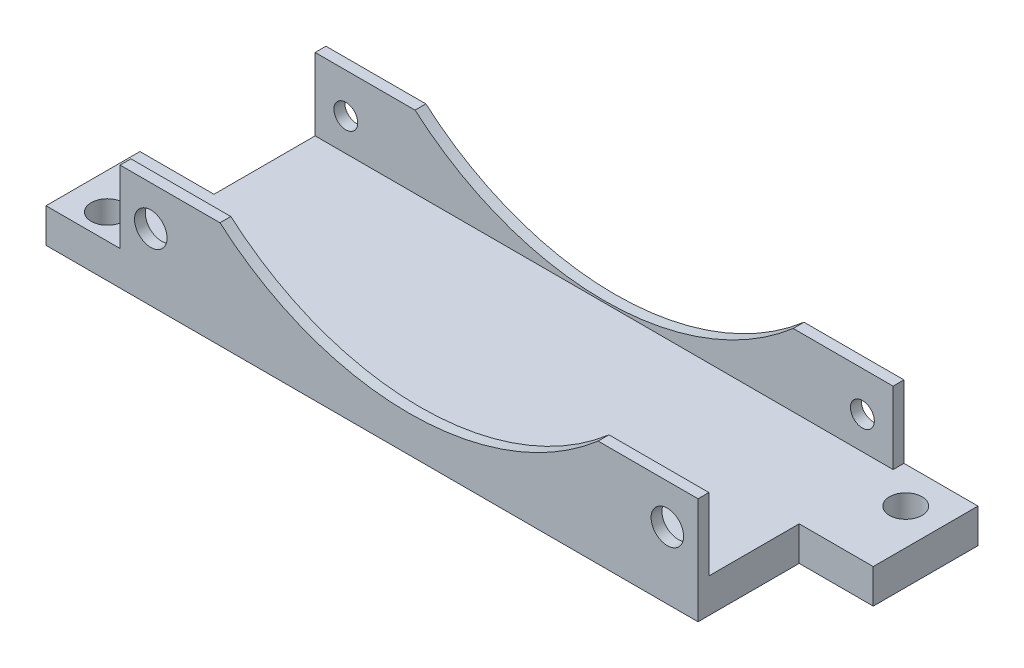
ISO-10303-21;
HEADER;
FILE_DESCRIPTION(('STEP AP214'),'2;1');
FILE_NAME('part.step','',(''),(''),'','','');
FILE_SCHEMA(('AUTOMOTIVE_DESIGN { 1 0 10303 214 1 1 1 1 }'));
ENDSEC;
DATA;
#1=APPLICATION_CONTEXT('core data for automotive mechanical design processes');
#2=APPLICATION_PROTOCOL_DEFINITION('international standard','automotive_design',2000,#1);
#3=PRODUCT_CONTEXT('',#1,'mechanical');
#4=PRODUCT('Part','Part','',(#3));
#5=PRODUCT_RELATED_PRODUCT_CATEGORY('part','',(#4));
#6=PRODUCT_DEFINITION_FORMATION('','',#4);
#7=PRODUCT_DEFINITION_CONTEXT('part definition',#1,'design');
#8=PRODUCT_DEFINITION('design','',#6,#7);
#9=PRODUCT_DEFINITION_SHAPE('','',#8);
#10=(LENGTH_UNIT() NAMED_UNIT(*) SI_UNIT(.MILLI.,.METRE.));
#11=(NAMED_UNIT(*) PLANE_ANGLE_UNIT() SI_UNIT($,.RADIAN.));
#12=(NAMED_UNIT(*) SI_UNIT($,.STERADIAN.) SOLID_ANGLE_UNIT());
#13=UNCERTAINTY_MEASURE_WITH_UNIT(LENGTH_MEASURE(1.E-05),#10,'distance_accuracy_value','');
#14=(GEOMETRIC_REPRESENTATION_CONTEXT(3) GLOBAL_UNCERTAINTY_ASSIGNED_CONTEXT((#13)) GLOBAL_UNIT_ASSIGNED_CONTEXT((#10,
#11,#12)) REPRESENTATION_CONTEXT('',''));
#15=CARTESIAN_POINT('',(0.,0.,0.));
#16=DIRECTION('',(0.,0.,1.));
#17=DIRECTION('',(1.,0.,0.));
#18=AXIS2_PLACEMENT_3D('',#15,#16,#17);
#19=CARTESIAN_POINT('',(40.,0.,28.5));
#20=DIRECTION('',(-1.,0.,0.));
#21=DIRECTION('',(0.,0.,1.));
#22=AXIS2_PLACEMENT_3D('',#19,#20,#21);
#23=PLANE('',#22);
#24=DIRECTION('',(0.,-1.,0.));
#25=VECTOR('',#24,1.);
#26=CARTESIAN_POINT('',(40.,-2.625,14.5));
#27=LINE('',#26,#25);
#28=CARTESIAN_POINT('',(40.,-2.625,14.5));
#29=VERTEX_POINT('',#28);
#30=CARTESIAN_POINT('',(40.,-7.375,14.5));
#31=VERTEX_POINT('',#30);
#32=EDGE_CURVE('E209',#29,#31,#27,.T.);
#33=ORIENTED_EDGE('',*,*,#32,.F.);
#34=DIRECTION('',(0.,0.,1.));
#35=VECTOR('',#34,1.);
#36=CARTESIAN_POINT('',(40.,-2.625,1.5));
#37=LINE('',#36,#35);
#38=CARTESIAN_POINT('',(40.,-2.625,27.));
#39=VERTEX_POINT('',#38);
#40=EDGE_CURVE('E308',#29,#39,#37,.T.);
#41=ORIENTED_EDGE('',*,*,#40,.T.);
#42=DIRECTION('',(0.,1.,0.));
#43=VECTOR('',#42,1.);
#44=CARTESIAN_POINT('',(40.,-2.625,27.));
#45=LINE('',#44,#43);
#46=CARTESIAN_POINT('',(40.,7.375,27.));
#47=VERTEX_POINT('',#46);
#48=EDGE_CURVE('E299',#39,#47,#45,.T.);
#49=ORIENTED_EDGE('',*,*,#48,.T.);
#50=DIRECTION('',(0.,0.,-1.));
#51=VECTOR('',#50,1.);
#52=CARTESIAN_POINT('',(40.,7.375,28.5));
#53=LINE('',#52,#51);
#54=CARTESIAN_POINT('',(40.,7.375,28.5));
#55=VERTEX_POINT('',#54);
#56=EDGE_CURVE('E371',#55,#47,#53,.T.);
#57=ORIENTED_EDGE('',*,*,#56,.F.);
#58=DIRECTION('',(0.,1.,0.));
#59=VECTOR('',#58,1.);
#60=CARTESIAN_POINT('',(40.,0.,28.5));
#61=LINE('',#60,#59);
#62=CARTESIAN_POINT('',(40.,-7.375,28.5));
#63=VERTEX_POINT('',#62);
#64=EDGE_CURVE('E345',#63,#55,#61,.T.);
#65=ORIENTED_EDGE('',*,*,#64,.F.);
#66=DIRECTION('',(0.,0.,-1.));
#67=VECTOR('',#66,1.);
#68=CARTESIAN_POINT('',(40.,-7.375,28.5));
#69=LINE('',#68,#67);
#70=EDGE_CURVE('E375',#63,#31,#69,.T.);
#71=ORIENTED_EDGE('',*,*,#70,.T.);
#72=EDGE_LOOP('',(#33,#41,#49,#57,#65,#71));
#73=FACE_BOUND('',#72,.T.);
#74=ADVANCED_FACE('F45',(#73),#23,.F.);
#75=CARTESIAN_POINT('',(-40.,0.,28.5));
#76=DIRECTION('',(-1.,0.,0.));
#77=DIRECTION('',(0.,0.,1.));
#78=AXIS2_PLACEMENT_3D('',#75,#76,#77);
#79=PLANE('',#78);
#80=DIRECTION('',(0.,1.,0.));
#81=VECTOR('',#80,1.);
#82=CARTESIAN_POINT('',(-40.,-2.625,27.));
#83=LINE('',#82,#81);
#84=CARTESIAN_POINT('',(-40.,-2.625,27.));
#85=VERTEX_POINT('',#84);
#86=CARTESIAN_POINT('',(-40.,7.375,27.));
#87=VERTEX_POINT('',#86);
#88=EDGE_CURVE('E298',#85,#87,#83,.T.);
#89=ORIENTED_EDGE('',*,*,#88,.F.);
#90=DIRECTION('',(0.,0.,1.));
#91=VECTOR('',#90,1.);
#92=CARTESIAN_POINT('',(-40.,-2.625,28.5));
#93=LINE('',#92,#91);
#94=CARTESIAN_POINT('',(-40.,-2.625,28.5));
#95=VERTEX_POINT('',#94);
#96=EDGE_CURVE('E55',#85,#95,#93,.T.);
#97=ORIENTED_EDGE('',*,*,#96,.T.);
#98=DIRECTION('',(0.,1.,0.));
#99=VECTOR('',#98,1.);
#100=CARTESIAN_POINT('',(-40.,0.,28.5));
#101=LINE('',#100,#99);
#102=CARTESIAN_POINT('',(-40.,7.375,28.5));
#103=VERTEX_POINT('',#102);
#104=EDGE_CURVE('E338',#95,#103,#101,.T.);
#105=ORIENTED_EDGE('',*,*,#104,.T.);
#106=DIRECTION('',(0.,0.,-1.));
#107=VECTOR('',#106,1.);
#108=CARTESIAN_POINT('',(-40.,7.375,28.5));
#109=LINE('',#108,#107);
#110=EDGE_CURVE('E366',#103,#87,#109,.T.);
#111=ORIENTED_EDGE('',*,*,#110,.T.);
#112=EDGE_LOOP('',(#89,#97,#105,#111));
#113=FACE_BOUND('',#112,.T.);
#114=ADVANCED_FACE('F410',(#113),#79,.T.);
#115=CARTESIAN_POINT('',(0.,7.375,28.5));
#116=DIRECTION('',(0.,1.,0.));
#117=DIRECTION('',(0.,0.,1.));
#118=AXIS2_PLACEMENT_3D('',#115,#116,#117);
#119=PLANE('',#118);
#120=DIRECTION('',(0.,0.,1.));
#121=VECTOR('',#120,1.);
#122=CARTESIAN_POINT('',(-26.1713106282433,7.37500000000001,0.));
#123=LINE('',#122,#121);
#124=CARTESIAN_POINT('',(-26.1713106282433,7.375,27.));
#125=VERTEX_POINT('',#124);
#126=CARTESIAN_POINT('',(-26.1713106282433,7.375,28.5));
#127=VERTEX_POINT('',#126);
#128=EDGE_CURVE('E263',#125,#127,#123,.T.);
#129=ORIENTED_EDGE('',*,*,#128,.F.);
#130=DIRECTION('',(-1.,0.,0.));
#131=VECTOR('',#130,1.);
#132=CARTESIAN_POINT('',(40.,7.375,27.));
#133=LINE('',#132,#131);
#134=EDGE_CURVE('E311',#125,#87,#133,.T.);
#135=ORIENTED_EDGE('',*,*,#134,.T.);
#136=ORIENTED_EDGE('',*,*,#110,.F.);
#137=DIRECTION('',(1.,0.,0.));
#138=VECTOR('',#137,1.);
#139=CARTESIAN_POINT('',(0.,7.375,28.5));
#140=LINE('',#139,#138);
#141=EDGE_CURVE('E350',#103,#127,#140,.T.);
#142=ORIENTED_EDGE('',*,*,#141,.T.);
#143=EDGE_LOOP('',(#129,#135,#136,#142));
#144=FACE_BOUND('',#143,.T.);
#145=ADVANCED_FACE('F402',(#144),#119,.T.);
#146=DIRECTION('',(0.,0.,1.));
#147=VECTOR('',#146,1.);
#148=CARTESIAN_POINT('',(-26.1713106282433,7.37500000000001,0.));
#149=LINE('',#148,#147);
#150=CARTESIAN_POINT('',(-26.1713106282433,7.375,0.));
#151=VERTEX_POINT('',#150);
#152=CARTESIAN_POINT('',(-26.1713106282433,7.375,1.5));
#153=VERTEX_POINT('',#152);
#154=EDGE_CURVE('E253',#151,#153,#149,.T.);
#155=ORIENTED_EDGE('',*,*,#154,.F.);
#156=DIRECTION('',(1.,0.,0.));
#157=VECTOR('',#156,1.);
#158=CARTESIAN_POINT('',(0.,7.375,0.));
#159=LINE('',#158,#157);
#160=CARTESIAN_POINT('',(-40.,7.375,0.));
#161=VERTEX_POINT('',#160);
#162=EDGE_CURVE('E342',#161,#151,#159,.T.);
#163=ORIENTED_EDGE('',*,*,#162,.F.);
#164=CARTESIAN_POINT('',(-40.,7.375,1.5));
#165=VERTEX_POINT('',#164);
#166=EDGE_CURVE('E354',#165,#161,#109,.T.);
#167=ORIENTED_EDGE('',*,*,#166,.F.);
#168=DIRECTION('',(-1.,0.,0.));
#169=VECTOR('',#168,1.);
#170=CARTESIAN_POINT('',(40.,7.375,1.5));
#171=LINE('',#170,#169);
#172=EDGE_CURVE('E333',#153,#165,#171,.T.);
#173=ORIENTED_EDGE('',*,*,#172,.F.);
#174=EDGE_LOOP('',(#155,#163,#167,#173));
#175=FACE_BOUND('',#174,.T.);
#176=ADVANCED_FACE('F394',(#175),#119,.T.);
#177=DIRECTION('',(0.,0.,1.));
#178=VECTOR('',#177,1.);
#179=CARTESIAN_POINT('',(26.1713106282433,7.37500000000001,0.));
#180=LINE('',#179,#178);
#181=CARTESIAN_POINT('',(26.1713106282433,7.375,28.5));
#182=VERTEX_POINT('',#181);
#183=CARTESIAN_POINT('',(26.1713106282433,7.375,27.));
#184=VERTEX_POINT('',#183);
#185=EDGE_CURVE('E260',#182,#184,#180,.F.);
#186=ORIENTED_EDGE('',*,*,#185,.F.);
#187=EDGE_CURVE('E349',#182,#55,#140,.T.);
#188=ORIENTED_EDGE('',*,*,#187,.T.);
#189=ORIENTED_EDGE('',*,*,#56,.T.);
#190=EDGE_CURVE('E334',#47,#184,#133,.T.);
#191=ORIENTED_EDGE('',*,*,#190,.T.);
#192=EDGE_LOOP('',(#186,#188,#189,#191));
#193=FACE_BOUND('',#192,.T.);
#194=ADVANCED_FACE('F421',(#193),#119,.T.);
#195=DIRECTION('',(0.,-1.,0.));
#196=VECTOR('',#195,1.);
#197=CARTESIAN_POINT('',(-40.,-2.625,15.5));
#198=LINE('',#197,#196);
#199=CARTESIAN_POINT('',(-40.,-2.625,15.5));
#200=VERTEX_POINT('',#199);
#201=CARTESIAN_POINT('',(-40.,-7.375,15.5));
#202=VERTEX_POINT('',#201);
#203=EDGE_CURVE('E234',#200,#202,#198,.T.);
#204=ORIENTED_EDGE('',*,*,#203,.F.);
#205=DIRECTION('',(0.,0.,1.));
#206=VECTOR('',#205,1.);
#207=CARTESIAN_POINT('',(-40.,-2.625,1.5));
#208=LINE('',#207,#206);
#209=CARTESIAN_POINT('',(-40.,-2.625,1.5));
#210=VERTEX_POINT('',#209);
#211=EDGE_CURVE('E304',#210,#200,#208,.T.);
#212=ORIENTED_EDGE('',*,*,#211,.F.);
#213=DIRECTION('',(0.,-1.,0.));
#214=VECTOR('',#213,1.);
#215=CARTESIAN_POINT('',(-40.,-2.625,1.5));
#216=LINE('',#215,#214);
#217=EDGE_CURVE('E315',#165,#210,#216,.T.);
#218=ORIENTED_EDGE('',*,*,#217,.F.);
#219=ORIENTED_EDGE('',*,*,#166,.T.);
#220=DIRECTION('',(0.,1.,0.));
#221=VECTOR('',#220,1.);
#222=CARTESIAN_POINT('',(-40.,0.,0.));
#223=LINE('',#222,#221);
#224=CARTESIAN_POINT('',(-40.,-7.375,0.));
#225=VERTEX_POINT('',#224);
#226=EDGE_CURVE('E325',#225,#161,#223,.T.);
#227=ORIENTED_EDGE('',*,*,#226,.F.);
#228=DIRECTION('',(0.,0.,-1.));
#229=VECTOR('',#228,1.);
#230=CARTESIAN_POINT('',(-40.,-7.375,28.5));
#231=LINE('',#230,#229);
#232=EDGE_CURVE('E378',#202,#225,#231,.T.);
#233=ORIENTED_EDGE('',*,*,#232,.F.);
#234=EDGE_LOOP('',(#204,#212,#218,#219,#227,#233));
#235=FACE_BOUND('',#234,.T.);
#236=ADVANCED_FACE('F47',(#235),#79,.T.);
#237=CARTESIAN_POINT('',(0.,-7.375,28.5));
#238=DIRECTION('',(0.,1.,0.));
#239=DIRECTION('',(0.,0.,1.));
#240=AXIS2_PLACEMENT_3D('',#237,#238,#239);
#241=PLANE('',#240);
#242=CARTESIAN_POINT('',(-45.25,-7.375,25.));
#243=DIRECTION('',(0.,1.,0.));
#244=DIRECTION('',(0.,0.,1.));
#245=AXIS2_PLACEMENT_3D('',#242,#243,#244);
#246=CIRCLE('',#245,2.25);
#247=CARTESIAN_POINT('',(-45.25,-7.375,27.25));
#248=VERTEX_POINT('',#247);
#249=EDGE_CURVE('E481',#248,#248,#246,.T.);
#250=ORIENTED_EDGE('',*,*,#249,.T.);
#251=EDGE_LOOP('',(#250));
#252=FACE_BOUND('',#251,.T.);
#253=CARTESIAN_POINT('',(45.25,-7.375,5.));
#254=DIRECTION('',(0.,1.,0.));
#255=DIRECTION('',(0.,0.,1.));
#256=AXIS2_PLACEMENT_3D('',#253,#254,#255);
#257=CIRCLE('',#256,2.25);
#258=CARTESIAN_POINT('',(45.25,-7.375,7.25));
#259=VERTEX_POINT('',#258);
#260=EDGE_CURVE('E207',#259,#259,#257,.T.);
#261=ORIENTED_EDGE('',*,*,#260,.T.);
#262=EDGE_LOOP('',(#261));
#263=FACE_BOUND('',#262,.T.);
#264=DIRECTION('',(1.,0.,0.));
#265=VECTOR('',#264,1.);
#266=CARTESIAN_POINT('',(0.,-7.375,0.));
#267=LINE('',#266,#265);
#268=CARTESIAN_POINT('',(50.25,-7.375,0.));
#269=VERTEX_POINT('',#268);
#270=EDGE_CURVE('E358',#225,#269,#267,.T.);
#271=ORIENTED_EDGE('',*,*,#270,.T.);
#272=DIRECTION('',(0.,0.,1.));
#273=VECTOR('',#272,1.);
#274=CARTESIAN_POINT('',(50.25,-7.375,0.));
#275=LINE('',#274,#273);
#276=CARTESIAN_POINT('',(50.25,-7.375,14.5));
#277=VERTEX_POINT('',#276);
#278=EDGE_CURVE('E179',#269,#277,#275,.T.);
#279=ORIENTED_EDGE('',*,*,#278,.T.);
#280=DIRECTION('',(-1.,0.,0.));
#281=VECTOR('',#280,1.);
#282=CARTESIAN_POINT('',(40.,-7.375,14.5));
#283=LINE('',#282,#281);
#284=EDGE_CURVE('E197',#277,#31,#283,.T.);
#285=ORIENTED_EDGE('',*,*,#284,.T.);
#286=ORIENTED_EDGE('',*,*,#70,.F.);
#287=DIRECTION('',(1.,0.,0.));
#288=VECTOR('',#287,1.);
#289=CARTESIAN_POINT('',(0.,-7.375,28.5));
#290=LINE('',#289,#288);
#291=CARTESIAN_POINT('',(-50.25,-7.375,28.5));
#292=VERTEX_POINT('',#291);
#293=EDGE_CURVE('E341',#292,#63,#290,.T.);
#294=ORIENTED_EDGE('',*,*,#293,.F.);
#295=DIRECTION('',(0.,0.,-1.));
#296=VECTOR('',#295,1.);
#297=CARTESIAN_POINT('',(-50.25,-7.375,28.5));
#298=LINE('',#297,#296);
#299=CARTESIAN_POINT('',(-50.25,-7.375,15.5));
#300=VERTEX_POINT('',#299);
#301=EDGE_CURVE('E212',#292,#300,#298,.T.);
#302=ORIENTED_EDGE('',*,*,#301,.T.);
#303=DIRECTION('',(1.,0.,0.));
#304=VECTOR('',#303,1.);
#305=CARTESIAN_POINT('',(-40.,-7.375,15.5));
#306=LINE('',#305,#304);
#307=EDGE_CURVE('E220',#300,#202,#306,.T.);
#308=ORIENTED_EDGE('',*,*,#307,.T.);
#309=ORIENTED_EDGE('',*,*,#232,.T.);
#310=EDGE_LOOP('',(#271,#279,#285,#286,#294,#302,#308,#309));
#311=FACE_BOUND('',#310,.T.);
#312=ADVANCED_FACE('F430',(#252,#263,#311),#241,.F.);
#313=DIRECTION('',(0.,-1.,0.));
#314=VECTOR('',#313,1.);
#315=CARTESIAN_POINT('',(40.,-2.625,1.5));
#316=LINE('',#315,#314);
#317=CARTESIAN_POINT('',(40.,7.375,1.50000000000001));
#318=VERTEX_POINT('',#317);
#319=CARTESIAN_POINT('',(40.,-2.625,1.5));
#320=VERTEX_POINT('',#319);
#321=EDGE_CURVE('E303',#318,#320,#316,.T.);
#322=ORIENTED_EDGE('',*,*,#321,.T.);
#323=DIRECTION('',(0.,0.,-1.));
#324=VECTOR('',#323,1.);
#325=CARTESIAN_POINT('',(40.,-2.625,0.));
#326=LINE('',#325,#324);
#327=CARTESIAN_POINT('',(40.,-2.625,0.));
#328=VERTEX_POINT('',#327);
#329=EDGE_CURVE('E11',#320,#328,#326,.T.);
#330=ORIENTED_EDGE('',*,*,#329,.T.);
#331=DIRECTION('',(0.,1.,0.));
#332=VECTOR('',#331,1.);
#333=CARTESIAN_POINT('',(40.,0.,0.));
#334=LINE('',#333,#332);
#335=CARTESIAN_POINT('',(40.,7.375,0.));
#336=VERTEX_POINT('',#335);
#337=EDGE_CURVE('E195',#328,#336,#334,.T.);
#338=ORIENTED_EDGE('',*,*,#337,.T.);
#339=EDGE_CURVE('E370',#318,#336,#53,.T.);
#340=ORIENTED_EDGE('',*,*,#339,.F.);
#341=EDGE_LOOP('',(#322,#330,#338,#340));
#342=FACE_BOUND('',#341,.T.);
#343=ADVANCED_FACE('F445',(#342),#23,.F.);
#344=DIRECTION('',(0.,0.,1.));
#345=VECTOR('',#344,1.);
#346=CARTESIAN_POINT('',(26.1713106282433,7.37500000000001,0.));
#347=LINE('',#346,#345);
#348=CARTESIAN_POINT('',(26.1713106282433,7.375,1.5));
#349=VERTEX_POINT('',#348);
#350=CARTESIAN_POINT('',(26.1713106282433,7.375,0.));
#351=VERTEX_POINT('',#350);
#352=EDGE_CURVE('E248',#349,#351,#347,.F.);
#353=ORIENTED_EDGE('',*,*,#352,.F.);
#354=EDGE_CURVE('E329',#318,#349,#171,.T.);
#355=ORIENTED_EDGE('',*,*,#354,.F.);
#356=ORIENTED_EDGE('',*,*,#339,.T.);
#357=EDGE_CURVE('E363',#351,#336,#159,.T.);
#358=ORIENTED_EDGE('',*,*,#357,.F.);
#359=EDGE_LOOP('',(#353,#355,#356,#358));
#360=FACE_BOUND('',#359,.T.);
#361=ADVANCED_FACE('F443',(#360),#119,.T.);
#362=CARTESIAN_POINT('',(0.,0.,28.5));
#363=DIRECTION('',(0.,0.,1.));
#364=DIRECTION('',(1.,0.,0.));
#365=AXIS2_PLACEMENT_3D('',#362,#363,#364);
#366=PLANE('',#365);
#367=CARTESIAN_POINT('',(0.,37.625,28.5));
#368=DIRECTION('',(0.,0.,1.));
#369=DIRECTION('',(1.,0.,0.));
#370=AXIS2_PLACEMENT_3D('',#367,#368,#369);
#371=CIRCLE('',#370,40.);
#372=EDGE_CURVE('E237',#127,#182,#371,.T.);
#373=ORIENTED_EDGE('',*,*,#372,.F.);
#374=ORIENTED_EDGE('',*,*,#141,.F.);
#375=ORIENTED_EDGE('',*,*,#104,.F.);
#376=DIRECTION('',(-1.,0.,0.));
#377=VECTOR('',#376,1.);
#378=CARTESIAN_POINT('',(-40.,-2.625,28.5));
#379=LINE('',#378,#377);
#380=CARTESIAN_POINT('',(-50.25,-2.625,28.5));
#381=VERTEX_POINT('',#380);
#382=EDGE_CURVE('E69',#95,#381,#379,.T.);
#383=ORIENTED_EDGE('',*,*,#382,.T.);
#384=DIRECTION('',(0.,-1.,0.));
#385=VECTOR('',#384,1.);
#386=CARTESIAN_POINT('',(-50.25,-2.625,28.5));
#387=LINE('',#386,#385);
#388=EDGE_CURVE('E227',#381,#292,#387,.T.);
#389=ORIENTED_EDGE('',*,*,#388,.T.);
#390=ORIENTED_EDGE('',*,*,#293,.T.);
#391=ORIENTED_EDGE('',*,*,#64,.T.);
#392=ORIENTED_EDGE('',*,*,#187,.F.);
#393=EDGE_LOOP('',(#373,#374,#375,#383,#389,#390,#391,#392));
#394=FACE_BOUND('',#393,.T.);
#395=CARTESIAN_POINT('',(35.75,1.875,28.5));
#396=DIRECTION('',(0.,0.,-1.));
#397=DIRECTION('',(-1.,0.,0.));
#398=AXIS2_PLACEMENT_3D('',#395,#396,#397);
#399=CIRCLE('',#398,2.25);
#400=CARTESIAN_POINT('',(33.5,1.875,28.5));
#401=VERTEX_POINT('',#400);
#402=EDGE_CURVE('E270',#401,#401,#399,.T.);
#403=ORIENTED_EDGE('',*,*,#402,.T.);
#404=EDGE_LOOP('',(#403));
#405=FACE_BOUND('',#404,.T.);
#406=CARTESIAN_POINT('',(-35.75,1.875,28.5));
#407=DIRECTION('',(0.,0.,-1.));
#408=DIRECTION('',(-1.,0.,0.));
#409=AXIS2_PLACEMENT_3D('',#406,#407,#408);
#410=CIRCLE('',#409,2.25);
#411=CARTESIAN_POINT('',(-38.,1.875,28.5));
#412=VERTEX_POINT('',#411);
#413=EDGE_CURVE('E278',#412,#412,#410,.T.);
#414=ORIENTED_EDGE('',*,*,#413,.T.);
#415=EDGE_LOOP('',(#414));
#416=FACE_BOUND('',#415,.T.);
#417=ADVANCED_FACE('F414',(#394,#405,#416),#366,.T.);
#418=CARTESIAN_POINT('',(0.,0.,0.));
#419=DIRECTION('',(0.,0.,1.));
#420=DIRECTION('',(1.,0.,0.));
#421=AXIS2_PLACEMENT_3D('',#418,#419,#420);
#422=PLANE('',#421);
#423=CARTESIAN_POINT('',(-35.75,1.875,0.));
#424=DIRECTION('',(0.,0.,1.));
#425=DIRECTION('',(1.,0.,0.));
#426=AXIS2_PLACEMENT_3D('',#423,#424,#425);
#427=CIRCLE('',#426,1.65);
#428=CARTESIAN_POINT('',(-34.1,1.875,0.));
#429=VERTEX_POINT('',#428);
#430=EDGE_CURVE('E286',#429,#429,#427,.T.);
#431=ORIENTED_EDGE('',*,*,#430,.T.);
#432=EDGE_LOOP('',(#431));
#433=FACE_BOUND('',#432,.T.);
#434=CARTESIAN_POINT('',(35.75,1.875,0.));
#435=DIRECTION('',(0.,0.,1.));
#436=DIRECTION('',(1.,0.,0.));
#437=AXIS2_PLACEMENT_3D('',#434,#435,#436);
#438=CIRCLE('',#437,1.65);
#439=CARTESIAN_POINT('',(37.4,1.875,0.));
#440=VERTEX_POINT('',#439);
#441=EDGE_CURVE('E294',#440,#440,#438,.T.);
#442=ORIENTED_EDGE('',*,*,#441,.T.);
#443=EDGE_LOOP('',(#442));
#444=FACE_BOUND('',#443,.T.);
#445=ORIENTED_EDGE('',*,*,#162,.T.);
#446=CARTESIAN_POINT('',(0.,37.625,0.));
#447=DIRECTION('',(0.,0.,1.));
#448=DIRECTION('',(1.,0.,0.));
#449=AXIS2_PLACEMENT_3D('',#446,#447,#448);
#450=CIRCLE('',#449,40.);
#451=EDGE_CURVE('E244',#151,#351,#450,.T.);
#452=ORIENTED_EDGE('',*,*,#451,.T.);
#453=ORIENTED_EDGE('',*,*,#357,.T.);
#454=ORIENTED_EDGE('',*,*,#337,.F.);
#455=DIRECTION('',(1.,0.,0.));
#456=VECTOR('',#455,1.);
#457=CARTESIAN_POINT('',(40.,-2.625,0.));
#458=LINE('',#457,#456);
#459=CARTESIAN_POINT('',(50.25,-2.625,0.));
#460=VERTEX_POINT('',#459);
#461=EDGE_CURVE('E63',#328,#460,#458,.T.);
#462=ORIENTED_EDGE('',*,*,#461,.T.);
#463=DIRECTION('',(0.,-1.,0.));
#464=VECTOR('',#463,1.);
#465=CARTESIAN_POINT('',(50.25,-2.625,0.));
#466=LINE('',#465,#464);
#467=EDGE_CURVE('E174',#460,#269,#466,.T.);
#468=ORIENTED_EDGE('',*,*,#467,.T.);
#469=ORIENTED_EDGE('',*,*,#270,.F.);
#470=ORIENTED_EDGE('',*,*,#226,.T.);
#471=EDGE_LOOP('',(#445,#452,#453,#454,#462,#468,#469,#470));
#472=FACE_BOUND('',#471,.T.);
#473=ADVANCED_FACE('F193',(#433,#444,#472),#422,.F.);
#474=CARTESIAN_POINT('',(40.,-2.625,27.));
#475=DIRECTION('',(0.,0.,1.));
#476=DIRECTION('',(1.,0.,0.));
#477=AXIS2_PLACEMENT_3D('',#474,#475,#476);
#478=PLANE('',#477);
#479=CARTESIAN_POINT('',(35.75,1.875,27.));
#480=DIRECTION('',(0.,0.,-1.));
#481=DIRECTION('',(-1.,0.,0.));
#482=AXIS2_PLACEMENT_3D('',#479,#480,#481);
#483=CIRCLE('',#482,2.25);
#484=CARTESIAN_POINT('',(33.5,1.875,27.));
#485=VERTEX_POINT('',#484);
#486=EDGE_CURVE('E266',#485,#485,#483,.T.);
#487=ORIENTED_EDGE('',*,*,#486,.F.);
#488=EDGE_LOOP('',(#487));
#489=FACE_BOUND('',#488,.T.);
#490=CARTESIAN_POINT('',(-35.75,1.875,27.));
#491=DIRECTION('',(0.,0.,-1.));
#492=DIRECTION('',(-1.,0.,0.));
#493=AXIS2_PLACEMENT_3D('',#490,#491,#492);
#494=CIRCLE('',#493,2.25);
#495=CARTESIAN_POINT('',(-38.,1.875,27.));
#496=VERTEX_POINT('',#495);
#497=EDGE_CURVE('E274',#496,#496,#494,.T.);
#498=ORIENTED_EDGE('',*,*,#497,.F.);
#499=EDGE_LOOP('',(#498));
#500=FACE_BOUND('',#499,.T.);
#501=ORIENTED_EDGE('',*,*,#134,.F.);
#502=CARTESIAN_POINT('',(0.,37.625,27.));
#503=DIRECTION('',(0.,0.,1.));
#504=DIRECTION('',(1.,0.,0.));
#505=AXIS2_PLACEMENT_3D('',#502,#503,#504);
#506=CIRCLE('',#505,40.);
#507=EDGE_CURVE('E256',#125,#184,#506,.T.);
#508=ORIENTED_EDGE('',*,*,#507,.T.);
#509=ORIENTED_EDGE('',*,*,#190,.F.);
#510=ORIENTED_EDGE('',*,*,#48,.F.);
#511=DIRECTION('',(-1.,0.,0.));
#512=VECTOR('',#511,1.);
#513=CARTESIAN_POINT('',(40.,-2.625,27.));
#514=LINE('',#513,#512);
#515=EDGE_CURVE('E321',#39,#85,#514,.T.);
#516=ORIENTED_EDGE('',*,*,#515,.T.);
#517=ORIENTED_EDGE('',*,*,#88,.T.);
#518=EDGE_LOOP('',(#501,#508,#509,#510,#516,#517));
#519=FACE_BOUND('',#518,.T.);
#520=ADVANCED_FACE('F406',(#489,#500,#519),#478,.F.);
#521=CARTESIAN_POINT('',(40.,-2.625,1.5));
#522=DIRECTION('',(0.,-1.,0.));
#523=DIRECTION('',(0.,0.,-1.));
#524=AXIS2_PLACEMENT_3D('',#521,#522,#523);
#525=PLANE('',#524);
#526=CARTESIAN_POINT('',(-45.25,-2.625,25.));
#527=DIRECTION('',(0.,1.,0.));
#528=DIRECTION('',(0.,0.,1.));
#529=AXIS2_PLACEMENT_3D('',#526,#527,#528);
#530=CIRCLE('',#529,2.24999999999999);
#531=CARTESIAN_POINT('',(-45.25,-2.625,27.25));
#532=VERTEX_POINT('',#531);
#533=EDGE_CURVE('E493',#532,#532,#530,.T.);
#534=ORIENTED_EDGE('',*,*,#533,.F.);
#535=EDGE_LOOP('',(#534));
#536=FACE_BOUND('',#535,.T.);
#537=CARTESIAN_POINT('',(45.25,-2.625,5.));
#538=DIRECTION('',(0.,1.,0.));
#539=DIRECTION('',(0.,0.,1.));
#540=AXIS2_PLACEMENT_3D('',#537,#538,#539);
#541=CIRCLE('',#540,2.24999999999999);
#542=CARTESIAN_POINT('',(45.25,-2.625,7.24999999999999));
#543=VERTEX_POINT('',#542);
#544=EDGE_CURVE('E486',#543,#543,#541,.T.);
#545=ORIENTED_EDGE('',*,*,#544,.F.);
#546=EDGE_LOOP('',(#545));
#547=FACE_BOUND('',#546,.T.);
#548=ORIENTED_EDGE('',*,*,#211,.T.);
#549=DIRECTION('',(1.,0.,0.));
#550=VECTOR('',#549,1.);
#551=CARTESIAN_POINT('',(-40.,-2.625,15.5));
#552=LINE('',#551,#550);
#553=CARTESIAN_POINT('',(-50.25,-2.625,15.5));
#554=VERTEX_POINT('',#553);
#555=EDGE_CURVE('E224',#554,#200,#552,.T.);
#556=ORIENTED_EDGE('',*,*,#555,.F.);
#557=DIRECTION('',(0.,0.,-1.));
#558=VECTOR('',#557,1.);
#559=CARTESIAN_POINT('',(-50.25,-2.625,28.5));
#560=LINE('',#559,#558);
#561=EDGE_CURVE('E219',#381,#554,#560,.T.);
#562=ORIENTED_EDGE('',*,*,#561,.F.);
#563=ORIENTED_EDGE('',*,*,#382,.F.);
#564=ORIENTED_EDGE('',*,*,#96,.F.);
#565=ORIENTED_EDGE('',*,*,#515,.F.);
#566=ORIENTED_EDGE('',*,*,#40,.F.);
#567=DIRECTION('',(-1.,0.,0.));
#568=VECTOR('',#567,1.);
#569=CARTESIAN_POINT('',(40.,-2.625,14.5));
#570=LINE('',#569,#568);
#571=CARTESIAN_POINT('',(50.25,-2.625,14.5));
#572=VERTEX_POINT('',#571);
#573=EDGE_CURVE('E184',#572,#29,#570,.T.);
#574=ORIENTED_EDGE('',*,*,#573,.F.);
#575=DIRECTION('',(0.,0.,1.));
#576=VECTOR('',#575,1.);
#577=CARTESIAN_POINT('',(50.25,-2.625,0.));
#578=LINE('',#577,#576);
#579=EDGE_CURVE('E176',#460,#572,#578,.T.);
#580=ORIENTED_EDGE('',*,*,#579,.F.);
#581=ORIENTED_EDGE('',*,*,#461,.F.);
#582=ORIENTED_EDGE('',*,*,#329,.F.);
#583=DIRECTION('',(-1.,0.,0.));
#584=VECTOR('',#583,1.);
#585=CARTESIAN_POINT('',(40.,-2.625,1.5));
#586=LINE('',#585,#584);
#587=EDGE_CURVE('E326',#320,#210,#586,.T.);
#588=ORIENTED_EDGE('',*,*,#587,.T.);
#589=EDGE_LOOP('',(#548,#556,#562,#563,#564,#565,#566,#574,#580,#581,#582,#588));
#590=FACE_BOUND('',#589,.T.);
#591=ADVANCED_FACE('F187',(#536,#547,#590),#525,.F.);
#592=CARTESIAN_POINT('',(40.,-2.625,1.5));
#593=DIRECTION('',(0.,0.,-1.));
#594=DIRECTION('',(-1.,0.,0.));
#595=AXIS2_PLACEMENT_3D('',#592,#593,#594);
#596=PLANE('',#595);
#597=CARTESIAN_POINT('',(-35.75,1.875,1.5));
#598=DIRECTION('',(0.,0.,1.));
#599=DIRECTION('',(1.,0.,0.));
#600=AXIS2_PLACEMENT_3D('',#597,#598,#599);
#601=CIRCLE('',#600,1.64999999999999);
#602=CARTESIAN_POINT('',(-34.1,1.875,1.5));
#603=VERTEX_POINT('',#602);
#604=EDGE_CURVE('E282',#603,#603,#601,.T.);
#605=ORIENTED_EDGE('',*,*,#604,.F.);
#606=EDGE_LOOP('',(#605));
#607=FACE_BOUND('',#606,.T.);
#608=CARTESIAN_POINT('',(35.75,1.875,1.5));
#609=DIRECTION('',(0.,0.,1.));
#610=DIRECTION('',(1.,0.,0.));
#611=AXIS2_PLACEMENT_3D('',#608,#609,#610);
#612=CIRCLE('',#611,1.64999999999999);
#613=CARTESIAN_POINT('',(37.4,1.875,1.5));
#614=VERTEX_POINT('',#613);
#615=EDGE_CURVE('E290',#614,#614,#612,.T.);
#616=ORIENTED_EDGE('',*,*,#615,.F.);
#617=EDGE_LOOP('',(#616));
#618=FACE_BOUND('',#617,.T.);
#619=ORIENTED_EDGE('',*,*,#354,.T.);
#620=CARTESIAN_POINT('',(0.,37.625,1.5));
#621=DIRECTION('',(0.,0.,-1.));
#622=DIRECTION('',(-1.,0.,0.));
#623=AXIS2_PLACEMENT_3D('',#620,#621,#622);
#624=CIRCLE('',#623,40.);
#625=EDGE_CURVE('E49',#349,#153,#624,.T.);
#626=ORIENTED_EDGE('',*,*,#625,.T.);
#627=ORIENTED_EDGE('',*,*,#172,.T.);
#628=ORIENTED_EDGE('',*,*,#217,.T.);
#629=ORIENTED_EDGE('',*,*,#587,.F.);
#630=ORIENTED_EDGE('',*,*,#321,.F.);
#631=EDGE_LOOP('',(#619,#626,#627,#628,#629,#630));
#632=FACE_BOUND('',#631,.T.);
#633=ADVANCED_FACE('F386',(#607,#618,#632),#596,.F.);
#634=CARTESIAN_POINT('',(35.75,1.875,1.5));
#635=DIRECTION('',(0.,0.,1.));
#636=DIRECTION('',(1.,0.,0.));
#637=AXIS2_PLACEMENT_3D('',#634,#635,#636);
#638=CYLINDRICAL_SURFACE('',#637,1.65);
#639=ORIENTED_EDGE('',*,*,#441,.F.);
#640=EDGE_LOOP('',(#639));
#641=FACE_BOUND('',#640,.T.);
#642=ORIENTED_EDGE('',*,*,#615,.T.);
#643=EDGE_LOOP('',(#642));
#644=FACE_BOUND('',#643,.T.);
#645=ADVANCED_FACE('F542',(#641,#644),#638,.F.);
#646=CARTESIAN_POINT('',(-35.75,1.875,1.5));
#647=DIRECTION('',(0.,0.,1.));
#648=DIRECTION('',(1.,0.,0.));
#649=AXIS2_PLACEMENT_3D('',#646,#647,#648);
#650=CYLINDRICAL_SURFACE('',#649,1.65);
#651=ORIENTED_EDGE('',*,*,#430,.F.);
#652=EDGE_LOOP('',(#651));
#653=FACE_BOUND('',#652,.T.);
#654=ORIENTED_EDGE('',*,*,#604,.T.);
#655=EDGE_LOOP('',(#654));
#656=FACE_BOUND('',#655,.T.);
#657=ADVANCED_FACE('F661',(#653,#656),#650,.F.);
#658=CARTESIAN_POINT('',(-35.75,1.875,27.));
#659=DIRECTION('',(0.,0.,-1.));
#660=DIRECTION('',(-1.,0.,0.));
#661=AXIS2_PLACEMENT_3D('',#658,#659,#660);
#662=CYLINDRICAL_SURFACE('',#661,2.25);
#663=ORIENTED_EDGE('',*,*,#413,.F.);
#664=EDGE_LOOP('',(#663));
#665=FACE_BOUND('',#664,.T.);
#666=ORIENTED_EDGE('',*,*,#497,.T.);
#667=EDGE_LOOP('',(#666));
#668=FACE_BOUND('',#667,.T.);
#669=ADVANCED_FACE('F651',(#665,#668),#662,.F.);
#670=CARTESIAN_POINT('',(35.75,1.875,27.));
#671=DIRECTION('',(0.,0.,-1.));
#672=DIRECTION('',(-1.,0.,0.));
#673=AXIS2_PLACEMENT_3D('',#670,#671,#672);
#674=CYLINDRICAL_SURFACE('',#673,2.25);
#675=ORIENTED_EDGE('',*,*,#402,.F.);
#676=EDGE_LOOP('',(#675));
#677=FACE_BOUND('',#676,.T.);
#678=ORIENTED_EDGE('',*,*,#486,.T.);
#679=EDGE_LOOP('',(#678));
#680=FACE_BOUND('',#679,.T.);
#681=ADVANCED_FACE('F619',(#677,#680),#674,.F.);
#682=CARTESIAN_POINT('',(0.,37.625,0.));
#683=DIRECTION('',(0.,0.,1.));
#684=DIRECTION('',(1.,0.,0.));
#685=AXIS2_PLACEMENT_3D('',#682,#683,#684);
#686=CYLINDRICAL_SURFACE('',#685,40.);
#687=ORIENTED_EDGE('',*,*,#154,.T.);
#688=ORIENTED_EDGE('',*,*,#625,.F.);
#689=ORIENTED_EDGE('',*,*,#352,.T.);
#690=ORIENTED_EDGE('',*,*,#451,.F.);
#691=EDGE_LOOP('',(#687,#688,#689,#690));
#692=FACE_BOUND('',#691,.T.);
#693=ADVANCED_FACE('F611',(#692),#686,.F.);
#694=ORIENTED_EDGE('',*,*,#128,.T.);
#695=ORIENTED_EDGE('',*,*,#372,.T.);
#696=ORIENTED_EDGE('',*,*,#185,.T.);
#697=ORIENTED_EDGE('',*,*,#507,.F.);
#698=EDGE_LOOP('',(#694,#695,#696,#697));
#699=FACE_BOUND('',#698,.T.);
#700=ADVANCED_FACE('F419',(#699),#686,.F.);
#701=CARTESIAN_POINT('',(-40.,-2.625,15.5));
#702=DIRECTION('',(0.,0.,-1.));
#703=DIRECTION('',(-1.,0.,0.));
#704=AXIS2_PLACEMENT_3D('',#701,#702,#703);
#705=PLANE('',#704);
#706=ORIENTED_EDGE('',*,*,#307,.F.);
#707=DIRECTION('',(0.,-1.,0.));
#708=VECTOR('',#707,1.);
#709=CARTESIAN_POINT('',(-50.25,-2.625,15.5));
#710=LINE('',#709,#708);
#711=EDGE_CURVE('E238',#554,#300,#710,.T.);
#712=ORIENTED_EDGE('',*,*,#711,.F.);
#713=ORIENTED_EDGE('',*,*,#555,.T.);
#714=ORIENTED_EDGE('',*,*,#203,.T.);
#715=EDGE_LOOP('',(#706,#712,#713,#714));
#716=FACE_BOUND('',#715,.T.);
#717=ADVANCED_FACE('F450',(#716),#705,.T.);
#718=CARTESIAN_POINT('',(-50.25,-2.625,28.5));
#719=DIRECTION('',(-1.,0.,0.));
#720=DIRECTION('',(0.,0.,1.));
#721=AXIS2_PLACEMENT_3D('',#718,#719,#720);
#722=PLANE('',#721);
#723=ORIENTED_EDGE('',*,*,#301,.F.);
#724=ORIENTED_EDGE('',*,*,#388,.F.);
#725=ORIENTED_EDGE('',*,*,#561,.T.);
#726=ORIENTED_EDGE('',*,*,#711,.T.);
#727=EDGE_LOOP('',(#723,#724,#725,#726));
#728=FACE_BOUND('',#727,.T.);
#729=ADVANCED_FACE('F453',(#728),#722,.T.);
#730=CARTESIAN_POINT('',(40.,-2.625,14.5));
#731=DIRECTION('',(0.,0.,1.));
#732=DIRECTION('',(1.,0.,0.));
#733=AXIS2_PLACEMENT_3D('',#730,#731,#732);
#734=PLANE('',#733);
#735=ORIENTED_EDGE('',*,*,#284,.F.);
#736=DIRECTION('',(0.,-1.,0.));
#737=VECTOR('',#736,1.);
#738=CARTESIAN_POINT('',(50.25,-2.625,14.5));
#739=LINE('',#738,#737);
#740=EDGE_CURVE('E183',#572,#277,#739,.T.);
#741=ORIENTED_EDGE('',*,*,#740,.F.);
#742=ORIENTED_EDGE('',*,*,#573,.T.);
#743=ORIENTED_EDGE('',*,*,#32,.T.);
#744=EDGE_LOOP('',(#735,#741,#742,#743));
#745=FACE_BOUND('',#744,.T.);
#746=ADVANCED_FACE('F429',(#745),#734,.T.);
#747=CARTESIAN_POINT('',(50.25,-2.625,0.));
#748=DIRECTION('',(1.,0.,0.));
#749=DIRECTION('',(0.,0.,-1.));
#750=AXIS2_PLACEMENT_3D('',#747,#748,#749);
#751=PLANE('',#750);
#752=ORIENTED_EDGE('',*,*,#278,.F.);
#753=ORIENTED_EDGE('',*,*,#467,.F.);
#754=ORIENTED_EDGE('',*,*,#579,.T.);
#755=ORIENTED_EDGE('',*,*,#740,.T.);
#756=EDGE_LOOP('',(#752,#753,#754,#755));
#757=FACE_BOUND('',#756,.T.);
#758=ADVANCED_FACE('F175',(#757),#751,.T.);
#759=CARTESIAN_POINT('',(45.25,-2.625,5.));
#760=DIRECTION('',(0.,1.,0.));
#761=DIRECTION('',(0.,0.,1.));
#762=AXIS2_PLACEMENT_3D('',#759,#760,#761);
#763=CYLINDRICAL_SURFACE('',#762,2.25);
#764=ORIENTED_EDGE('',*,*,#260,.F.);
#765=EDGE_LOOP('',(#764));
#766=FACE_BOUND('',#765,.T.);
#767=ORIENTED_EDGE('',*,*,#544,.T.);
#768=EDGE_LOOP('',(#767));
#769=FACE_BOUND('',#768,.T.);
#770=ADVANCED_FACE('F505',(#766,#769),#763,.F.);
#771=CARTESIAN_POINT('',(-45.25,-2.625,25.));
#772=DIRECTION('',(0.,1.,0.));
#773=DIRECTION('',(0.,0.,1.));
#774=AXIS2_PLACEMENT_3D('',#771,#772,#773);
#775=CYLINDRICAL_SURFACE('',#774,2.25);
#776=ORIENTED_EDGE('',*,*,#249,.F.);
#777=EDGE_LOOP('',(#776));
#778=FACE_BOUND('',#777,.T.);
#779=ORIENTED_EDGE('',*,*,#533,.T.);
#780=EDGE_LOOP('',(#779));
#781=FACE_BOUND('',#780,.T.);
#782=ADVANCED_FACE('F498',(#778,#781),#775,.F.);
#783=CLOSED_SHELL('',(#74,#114,#145,#176,#194,#236,#312,#343,#361,#417,#473,#520,#591,#633,#645,
#657,#669,#681,#693,#700,#717,#729,#746,#758,#770,#782));
#784=MANIFOLD_SOLID_BREP('B2',#783);
#785=ADVANCED_BREP_SHAPE_REPRESENTATION('',(#18,#784),#14);
#786=SHAPE_DEFINITION_REPRESENTATION(#9,#785);
ENDSEC;
END-ISO-10303-21;
